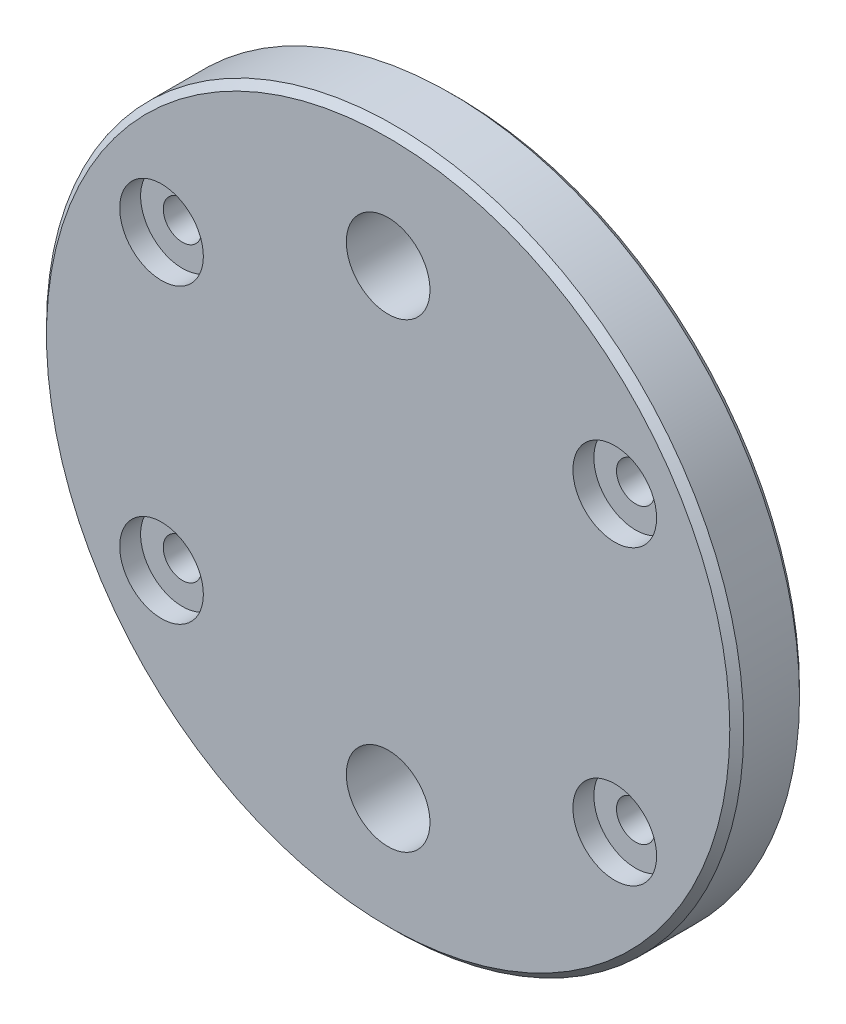
ISO-10303-21;
HEADER;
FILE_DESCRIPTION(('STEP AP214'),'2;1');
FILE_NAME('part.step','',(''),(''),'','','');
FILE_SCHEMA(('AUTOMOTIVE_DESIGN { 1 0 10303 214 1 1 1 1 }'));
ENDSEC;
DATA;
#1=APPLICATION_CONTEXT('core data for automotive mechanical design processes');
#2=APPLICATION_PROTOCOL_DEFINITION('international standard','automotive_design',2000,#1);
#3=PRODUCT_CONTEXT('',#1,'mechanical');
#4=PRODUCT('Part','Part','',(#3));
#5=PRODUCT_RELATED_PRODUCT_CATEGORY('part','',(#4));
#6=PRODUCT_DEFINITION_FORMATION('','',#4);
#7=PRODUCT_DEFINITION_CONTEXT('part definition',#1,'design');
#8=PRODUCT_DEFINITION('design','',#6,#7);
#9=PRODUCT_DEFINITION_SHAPE('','',#8);
#10=(LENGTH_UNIT() NAMED_UNIT(*) SI_UNIT(.MILLI.,.METRE.));
#11=(NAMED_UNIT(*) PLANE_ANGLE_UNIT() SI_UNIT($,.RADIAN.));
#12=(NAMED_UNIT(*) SI_UNIT($,.STERADIAN.) SOLID_ANGLE_UNIT());
#13=UNCERTAINTY_MEASURE_WITH_UNIT(LENGTH_MEASURE(1.E-05),#10,'distance_accuracy_value','');
#14=(GEOMETRIC_REPRESENTATION_CONTEXT(3) GLOBAL_UNCERTAINTY_ASSIGNED_CONTEXT((#13)) GLOBAL_UNIT_ASSIGNED_CONTEXT((#10,
#11,#12)) REPRESENTATION_CONTEXT('',''));
#15=CARTESIAN_POINT('',(0.,0.,0.));
#16=DIRECTION('',(0.,0.,1.));
#17=DIRECTION('',(1.,0.,0.));
#18=AXIS2_PLACEMENT_3D('',#15,#16,#17);
#19=CARTESIAN_POINT('',(0.,0.,0.));
#20=DIRECTION('',(0.,0.,1.));
#21=DIRECTION('',(1.,0.,0.));
#22=AXIS2_PLACEMENT_3D('',#19,#20,#21);
#23=PLANE('',#22);
#24=CARTESIAN_POINT('',(0.,0.,0.));
#25=DIRECTION('',(0.,0.,1.));
#26=DIRECTION('',(1.,0.,0.));
#27=AXIS2_PLACEMENT_3D('',#24,#25,#26);
#28=CIRCLE('',#27,49.);
#29=CARTESIAN_POINT('',(49.,0.,0.));
#30=VERTEX_POINT('',#29);
#31=EDGE_CURVE('E48',#30,#30,#28,.F.);
#32=ORIENTED_EDGE('',*,*,#31,.T.);
#33=EDGE_LOOP('',(#32));
#34=FACE_BOUND('',#33,.T.);
#35=CARTESIAN_POINT('',(32.5,21.,0.));
#36=DIRECTION('',(0.,0.,-1.));
#37=DIRECTION('',(-1.,0.,0.));
#38=AXIS2_PLACEMENT_3D('',#35,#36,#37);
#39=CIRCLE('',#38,5.6);
#40=CARTESIAN_POINT('',(26.9,21.,0.));
#41=VERTEX_POINT('',#40);
#42=EDGE_CURVE('E156',#41,#41,#39,.T.);
#43=ORIENTED_EDGE('',*,*,#42,.F.);
#44=EDGE_LOOP('',(#43));
#45=FACE_BOUND('',#44,.T.);
#46=CARTESIAN_POINT('',(32.5,-21.,0.));
#47=DIRECTION('',(0.,0.,-1.));
#48=DIRECTION('',(-1.,0.,0.));
#49=AXIS2_PLACEMENT_3D('',#46,#47,#48);
#50=CIRCLE('',#49,5.6);
#51=CARTESIAN_POINT('',(26.9,-21.,0.));
#52=VERTEX_POINT('',#51);
#53=EDGE_CURVE('E148',#52,#52,#50,.T.);
#54=ORIENTED_EDGE('',*,*,#53,.F.);
#55=EDGE_LOOP('',(#54));
#56=FACE_BOUND('',#55,.T.);
#57=CARTESIAN_POINT('',(-32.5,-21.,0.));
#58=DIRECTION('',(0.,0.,-1.));
#59=DIRECTION('',(-1.,0.,0.));
#60=AXIS2_PLACEMENT_3D('',#57,#58,#59);
#61=CIRCLE('',#60,5.6);
#62=CARTESIAN_POINT('',(-38.1,-21.,0.));
#63=VERTEX_POINT('',#62);
#64=EDGE_CURVE('E140',#63,#63,#61,.T.);
#65=ORIENTED_EDGE('',*,*,#64,.F.);
#66=EDGE_LOOP('',(#65));
#67=FACE_BOUND('',#66,.T.);
#68=CARTESIAN_POINT('',(0.,-33.07,0.));
#69=DIRECTION('',(0.,0.,1.));
#70=DIRECTION('',(1.,0.,0.));
#71=AXIS2_PLACEMENT_3D('',#68,#69,#70);
#72=CIRCLE('',#71,6.);
#73=CARTESIAN_POINT('',(6.,-33.07,0.));
#74=VERTEX_POINT('',#73);
#75=EDGE_CURVE('E112',#74,#74,#72,.T.);
#76=ORIENTED_EDGE('',*,*,#75,.T.);
#77=EDGE_LOOP('',(#76));
#78=FACE_BOUND('',#77,.T.);
#79=CARTESIAN_POINT('',(0.,33.07,0.));
#80=DIRECTION('',(0.,0.,1.));
#81=DIRECTION('',(1.,0.,0.));
#82=AXIS2_PLACEMENT_3D('',#79,#80,#81);
#83=CIRCLE('',#82,6.);
#84=CARTESIAN_POINT('',(6.,33.07,0.));
#85=VERTEX_POINT('',#84);
#86=EDGE_CURVE('E120',#85,#85,#83,.T.);
#87=ORIENTED_EDGE('',*,*,#86,.T.);
#88=EDGE_LOOP('',(#87));
#89=FACE_BOUND('',#88,.T.);
#90=CARTESIAN_POINT('',(-32.5,21.,0.));
#91=DIRECTION('',(0.,0.,-1.));
#92=DIRECTION('',(-1.,0.,0.));
#93=AXIS2_PLACEMENT_3D('',#90,#91,#92);
#94=CIRCLE('',#93,5.6);
#95=CARTESIAN_POINT('',(-38.1,21.,0.));
#96=VERTEX_POINT('',#95);
#97=EDGE_CURVE('E132',#96,#96,#94,.T.);
#98=ORIENTED_EDGE('',*,*,#97,.F.);
#99=EDGE_LOOP('',(#98));
#100=FACE_BOUND('',#99,.T.);
#101=ADVANCED_FACE('F39',(#34,#45,#56,#67,#78,#89,#100),#23,.F.);
#102=CARTESIAN_POINT('',(0.,0.,10.));
#103=DIRECTION('',(0.,0.,-1.));
#104=DIRECTION('',(-1.,0.,0.));
#105=AXIS2_PLACEMENT_3D('',#102,#103,#104);
#106=CYLINDRICAL_SURFACE('',#105,50.);
#107=CARTESIAN_POINT('',(0.,0.,1.));
#108=DIRECTION('',(0.,0.,1.));
#109=DIRECTION('',(1.,0.,0.));
#110=AXIS2_PLACEMENT_3D('',#107,#108,#109);
#111=CIRCLE('',#110,50.);
#112=CARTESIAN_POINT('',(50.,0.,1.));
#113=VERTEX_POINT('',#112);
#114=EDGE_CURVE('E53',#113,#113,#111,.T.);
#115=ORIENTED_EDGE('',*,*,#114,.T.);
#116=EDGE_LOOP('',(#115));
#117=FACE_BOUND('',#116,.T.);
#118=CARTESIAN_POINT('',(0.,0.,9.00000000000004));
#119=DIRECTION('',(0.,0.,1.));
#120=DIRECTION('',(1.,0.,0.));
#121=AXIS2_PLACEMENT_3D('',#118,#119,#120);
#122=CIRCLE('',#121,50.);
#123=CARTESIAN_POINT('',(50.,0.,9.00000000000004));
#124=VERTEX_POINT('',#123);
#125=EDGE_CURVE('E58',#124,#124,#122,.F.);
#126=ORIENTED_EDGE('',*,*,#125,.T.);
#127=EDGE_LOOP('',(#126));
#128=FACE_BOUND('',#127,.T.);
#129=ADVANCED_FACE('F165',(#117,#128),#106,.T.);
#130=CARTESIAN_POINT('',(0.,0.,10.));
#131=DIRECTION('',(0.,0.,1.));
#132=DIRECTION('',(1.,0.,0.));
#133=AXIS2_PLACEMENT_3D('',#130,#131,#132);
#134=PLANE('',#133);
#135=CARTESIAN_POINT('',(0.,0.,10.));
#136=DIRECTION('',(0.,0.,1.));
#137=DIRECTION('',(1.,0.,0.));
#138=AXIS2_PLACEMENT_3D('',#135,#136,#137);
#139=CIRCLE('',#138,49.0000000000001);
#140=CARTESIAN_POINT('',(49.0000000000001,0.,10.));
#141=VERTEX_POINT('',#140);
#142=EDGE_CURVE('E10',#141,#141,#139,.T.);
#143=ORIENTED_EDGE('',*,*,#142,.T.);
#144=EDGE_LOOP('',(#143));
#145=FACE_BOUND('',#144,.T.);
#146=CARTESIAN_POINT('',(0.,33.07,10.));
#147=DIRECTION('',(0.,0.,1.));
#148=DIRECTION('',(1.,0.,0.));
#149=AXIS2_PLACEMENT_3D('',#146,#147,#148);
#150=CIRCLE('',#149,6.);
#151=CARTESIAN_POINT('',(6.,33.07,10.));
#152=VERTEX_POINT('',#151);
#153=EDGE_CURVE('E124',#152,#152,#150,.T.);
#154=ORIENTED_EDGE('',*,*,#153,.F.);
#155=EDGE_LOOP('',(#154));
#156=FACE_BOUND('',#155,.T.);
#157=CARTESIAN_POINT('',(0.,-33.07,10.));
#158=DIRECTION('',(0.,0.,1.));
#159=DIRECTION('',(1.,0.,0.));
#160=AXIS2_PLACEMENT_3D('',#157,#158,#159);
#161=CIRCLE('',#160,6.);
#162=CARTESIAN_POINT('',(6.,-33.07,10.));
#163=VERTEX_POINT('',#162);
#164=EDGE_CURVE('E116',#163,#163,#161,.T.);
#165=ORIENTED_EDGE('',*,*,#164,.F.);
#166=EDGE_LOOP('',(#165));
#167=FACE_BOUND('',#166,.T.);
#168=CARTESIAN_POINT('',(-32.5,21.,10.));
#169=DIRECTION('',(0.,0.,1.));
#170=DIRECTION('',(1.,0.,0.));
#171=AXIS2_PLACEMENT_3D('',#168,#169,#170);
#172=CIRCLE('',#171,6.);
#173=CARTESIAN_POINT('',(-26.5,21.,10.));
#174=VERTEX_POINT('',#173);
#175=EDGE_CURVE('E108',#174,#174,#172,.T.);
#176=ORIENTED_EDGE('',*,*,#175,.F.);
#177=EDGE_LOOP('',(#176));
#178=FACE_BOUND('',#177,.T.);
#179=CARTESIAN_POINT('',(32.5,21.,10.));
#180=DIRECTION('',(0.,0.,1.));
#181=DIRECTION('',(1.,0.,0.));
#182=AXIS2_PLACEMENT_3D('',#179,#180,#181);
#183=CIRCLE('',#182,6.);
#184=CARTESIAN_POINT('',(38.5,21.,10.));
#185=VERTEX_POINT('',#184);
#186=EDGE_CURVE('E96',#185,#185,#183,.T.);
#187=ORIENTED_EDGE('',*,*,#186,.F.);
#188=EDGE_LOOP('',(#187));
#189=FACE_BOUND('',#188,.T.);
#190=CARTESIAN_POINT('',(32.5,-21.,10.));
#191=DIRECTION('',(0.,0.,1.));
#192=DIRECTION('',(1.,0.,0.));
#193=AXIS2_PLACEMENT_3D('',#190,#191,#192);
#194=CIRCLE('',#193,6.);
#195=CARTESIAN_POINT('',(38.5,-21.,10.));
#196=VERTEX_POINT('',#195);
#197=EDGE_CURVE('E84',#196,#196,#194,.T.);
#198=ORIENTED_EDGE('',*,*,#197,.F.);
#199=EDGE_LOOP('',(#198));
#200=FACE_BOUND('',#199,.T.);
#201=CARTESIAN_POINT('',(-32.5,-21.,10.));
#202=DIRECTION('',(0.,0.,1.));
#203=DIRECTION('',(1.,0.,0.));
#204=AXIS2_PLACEMENT_3D('',#201,#202,#203);
#205=CIRCLE('',#204,6.);
#206=CARTESIAN_POINT('',(-26.5,-21.,10.));
#207=VERTEX_POINT('',#206);
#208=EDGE_CURVE('E72',#207,#207,#205,.T.);
#209=ORIENTED_EDGE('',*,*,#208,.F.);
#210=EDGE_LOOP('',(#209));
#211=FACE_BOUND('',#210,.T.);
#212=ADVANCED_FACE('F246',(#145,#156,#167,#178,#189,#200,#211),#134,.T.);
#213=CARTESIAN_POINT('',(-32.5,-21.,10.));
#214=DIRECTION('',(0.,0.,1.));
#215=DIRECTION('',(1.,0.,0.));
#216=AXIS2_PLACEMENT_3D('',#213,#214,#215);
#217=CYLINDRICAL_SURFACE('',#216,2.75);
#218=CARTESIAN_POINT('',(-32.5,-21.,2.85));
#219=DIRECTION('',(0.,0.,-1.));
#220=DIRECTION('',(-1.,0.,0.));
#221=AXIS2_PLACEMENT_3D('',#218,#219,#220);
#222=CIRCLE('',#221,2.75);
#223=CARTESIAN_POINT('',(-35.25,-21.,2.85));
#224=VERTEX_POINT('',#223);
#225=EDGE_CURVE('E136',#224,#224,#222,.T.);
#226=ORIENTED_EDGE('',*,*,#225,.T.);
#227=EDGE_LOOP('',(#226));
#228=FACE_BOUND('',#227,.T.);
#229=CARTESIAN_POINT('',(-32.5,-21.,7.));
#230=DIRECTION('',(0.,0.,1.));
#231=DIRECTION('',(1.,0.,0.));
#232=AXIS2_PLACEMENT_3D('',#229,#230,#231);
#233=CIRCLE('',#232,2.75);
#234=CARTESIAN_POINT('',(-29.75,-21.,7.));
#235=VERTEX_POINT('',#234);
#236=EDGE_CURVE('E64',#235,#235,#233,.T.);
#237=ORIENTED_EDGE('',*,*,#236,.T.);
#238=EDGE_LOOP('',(#237));
#239=FACE_BOUND('',#238,.T.);
#240=ADVANCED_FACE('F242',(#228,#239),#217,.F.);
#241=CARTESIAN_POINT('',(-29.75,-21.,7.));
#242=DIRECTION('',(0.,0.,-1.));
#243=DIRECTION('',(-1.,0.,0.));
#244=AXIS2_PLACEMENT_3D('',#241,#242,#243);
#245=PLANE('',#244);
#246=ORIENTED_EDGE('',*,*,#236,.F.);
#247=EDGE_LOOP('',(#246));
#248=FACE_BOUND('',#247,.T.);
#249=CARTESIAN_POINT('',(-32.5,-21.,7.));
#250=DIRECTION('',(0.,0.,1.));
#251=DIRECTION('',(1.,0.,0.));
#252=AXIS2_PLACEMENT_3D('',#249,#250,#251);
#253=CIRCLE('',#252,6.);
#254=CARTESIAN_POINT('',(-26.5,-21.,7.));
#255=VERTEX_POINT('',#254);
#256=EDGE_CURVE('E68',#255,#255,#253,.T.);
#257=ORIENTED_EDGE('',*,*,#256,.T.);
#258=EDGE_LOOP('',(#257));
#259=FACE_BOUND('',#258,.T.);
#260=ADVANCED_FACE('F238',(#248,#259),#245,.F.);
#261=CARTESIAN_POINT('',(-32.5,-21.,10.));
#262=DIRECTION('',(0.,0.,1.));
#263=DIRECTION('',(1.,0.,0.));
#264=AXIS2_PLACEMENT_3D('',#261,#262,#263);
#265=CYLINDRICAL_SURFACE('',#264,6.);
#266=ORIENTED_EDGE('',*,*,#256,.F.);
#267=EDGE_LOOP('',(#266));
#268=FACE_BOUND('',#267,.T.);
#269=ORIENTED_EDGE('',*,*,#208,.T.);
#270=EDGE_LOOP('',(#269));
#271=FACE_BOUND('',#270,.T.);
#272=ADVANCED_FACE('F234',(#268,#271),#265,.F.);
#273=CARTESIAN_POINT('',(32.5,-21.,10.));
#274=DIRECTION('',(0.,0.,1.));
#275=DIRECTION('',(1.,0.,0.));
#276=AXIS2_PLACEMENT_3D('',#273,#274,#275);
#277=CYLINDRICAL_SURFACE('',#276,2.75);
#278=CARTESIAN_POINT('',(32.5,-21.,2.85));
#279=DIRECTION('',(0.,0.,-1.));
#280=DIRECTION('',(-1.,0.,0.));
#281=AXIS2_PLACEMENT_3D('',#278,#279,#280);
#282=CIRCLE('',#281,2.75);
#283=CARTESIAN_POINT('',(29.75,-21.,2.85));
#284=VERTEX_POINT('',#283);
#285=EDGE_CURVE('E144',#284,#284,#282,.T.);
#286=ORIENTED_EDGE('',*,*,#285,.T.);
#287=EDGE_LOOP('',(#286));
#288=FACE_BOUND('',#287,.T.);
#289=CARTESIAN_POINT('',(32.5,-21.,7.));
#290=DIRECTION('',(0.,0.,1.));
#291=DIRECTION('',(1.,0.,0.));
#292=AXIS2_PLACEMENT_3D('',#289,#290,#291);
#293=CIRCLE('',#292,2.75);
#294=CARTESIAN_POINT('',(35.25,-21.,7.));
#295=VERTEX_POINT('',#294);
#296=EDGE_CURVE('E76',#295,#295,#293,.T.);
#297=ORIENTED_EDGE('',*,*,#296,.T.);
#298=EDGE_LOOP('',(#297));
#299=FACE_BOUND('',#298,.T.);
#300=ADVANCED_FACE('F230',(#288,#299),#277,.F.);
#301=CARTESIAN_POINT('',(35.25,-21.,7.));
#302=DIRECTION('',(0.,0.,-1.));
#303=DIRECTION('',(-1.,0.,0.));
#304=AXIS2_PLACEMENT_3D('',#301,#302,#303);
#305=PLANE('',#304);
#306=ORIENTED_EDGE('',*,*,#296,.F.);
#307=EDGE_LOOP('',(#306));
#308=FACE_BOUND('',#307,.T.);
#309=CARTESIAN_POINT('',(32.5,-21.,7.));
#310=DIRECTION('',(0.,0.,1.));
#311=DIRECTION('',(1.,0.,0.));
#312=AXIS2_PLACEMENT_3D('',#309,#310,#311);
#313=CIRCLE('',#312,6.);
#314=CARTESIAN_POINT('',(38.5,-21.,7.));
#315=VERTEX_POINT('',#314);
#316=EDGE_CURVE('E80',#315,#315,#313,.T.);
#317=ORIENTED_EDGE('',*,*,#316,.T.);
#318=EDGE_LOOP('',(#317));
#319=FACE_BOUND('',#318,.T.);
#320=ADVANCED_FACE('F226',(#308,#319),#305,.F.);
#321=CARTESIAN_POINT('',(32.5,-21.,10.));
#322=DIRECTION('',(0.,0.,1.));
#323=DIRECTION('',(1.,0.,0.));
#324=AXIS2_PLACEMENT_3D('',#321,#322,#323);
#325=CYLINDRICAL_SURFACE('',#324,6.);
#326=ORIENTED_EDGE('',*,*,#316,.F.);
#327=EDGE_LOOP('',(#326));
#328=FACE_BOUND('',#327,.T.);
#329=ORIENTED_EDGE('',*,*,#197,.T.);
#330=EDGE_LOOP('',(#329));
#331=FACE_BOUND('',#330,.T.);
#332=ADVANCED_FACE('F222',(#328,#331),#325,.F.);
#333=CARTESIAN_POINT('',(32.5,21.,10.));
#334=DIRECTION('',(0.,0.,1.));
#335=DIRECTION('',(1.,0.,0.));
#336=AXIS2_PLACEMENT_3D('',#333,#334,#335);
#337=CYLINDRICAL_SURFACE('',#336,2.75);
#338=CARTESIAN_POINT('',(32.5,21.,2.85));
#339=DIRECTION('',(0.,0.,-1.));
#340=DIRECTION('',(-1.,0.,0.));
#341=AXIS2_PLACEMENT_3D('',#338,#339,#340);
#342=CIRCLE('',#341,2.75);
#343=CARTESIAN_POINT('',(29.75,21.,2.85));
#344=VERTEX_POINT('',#343);
#345=EDGE_CURVE('E152',#344,#344,#342,.T.);
#346=ORIENTED_EDGE('',*,*,#345,.T.);
#347=EDGE_LOOP('',(#346));
#348=FACE_BOUND('',#347,.T.);
#349=CARTESIAN_POINT('',(32.5,21.,7.));
#350=DIRECTION('',(0.,0.,1.));
#351=DIRECTION('',(1.,0.,0.));
#352=AXIS2_PLACEMENT_3D('',#349,#350,#351);
#353=CIRCLE('',#352,2.75);
#354=CARTESIAN_POINT('',(35.25,21.,7.));
#355=VERTEX_POINT('',#354);
#356=EDGE_CURVE('E88',#355,#355,#353,.T.);
#357=ORIENTED_EDGE('',*,*,#356,.T.);
#358=EDGE_LOOP('',(#357));
#359=FACE_BOUND('',#358,.T.);
#360=ADVANCED_FACE('F218',(#348,#359),#337,.F.);
#361=CARTESIAN_POINT('',(35.25,21.,7.));
#362=DIRECTION('',(0.,0.,-1.));
#363=DIRECTION('',(-1.,0.,0.));
#364=AXIS2_PLACEMENT_3D('',#361,#362,#363);
#365=PLANE('',#364);
#366=ORIENTED_EDGE('',*,*,#356,.F.);
#367=EDGE_LOOP('',(#366));
#368=FACE_BOUND('',#367,.T.);
#369=CARTESIAN_POINT('',(32.5,21.,7.));
#370=DIRECTION('',(0.,0.,1.));
#371=DIRECTION('',(1.,0.,0.));
#372=AXIS2_PLACEMENT_3D('',#369,#370,#371);
#373=CIRCLE('',#372,6.);
#374=CARTESIAN_POINT('',(38.5,21.,7.));
#375=VERTEX_POINT('',#374);
#376=EDGE_CURVE('E92',#375,#375,#373,.T.);
#377=ORIENTED_EDGE('',*,*,#376,.T.);
#378=EDGE_LOOP('',(#377));
#379=FACE_BOUND('',#378,.T.);
#380=ADVANCED_FACE('F214',(#368,#379),#365,.F.);
#381=CARTESIAN_POINT('',(32.5,21.,10.));
#382=DIRECTION('',(0.,0.,1.));
#383=DIRECTION('',(1.,0.,0.));
#384=AXIS2_PLACEMENT_3D('',#381,#382,#383);
#385=CYLINDRICAL_SURFACE('',#384,6.);
#386=ORIENTED_EDGE('',*,*,#376,.F.);
#387=EDGE_LOOP('',(#386));
#388=FACE_BOUND('',#387,.T.);
#389=ORIENTED_EDGE('',*,*,#186,.T.);
#390=EDGE_LOOP('',(#389));
#391=FACE_BOUND('',#390,.T.);
#392=ADVANCED_FACE('F210',(#388,#391),#385,.F.);
#393=CARTESIAN_POINT('',(-32.5,21.,10.));
#394=DIRECTION('',(0.,0.,1.));
#395=DIRECTION('',(1.,0.,0.));
#396=AXIS2_PLACEMENT_3D('',#393,#394,#395);
#397=CYLINDRICAL_SURFACE('',#396,2.75);
#398=CARTESIAN_POINT('',(-32.5,21.,2.85));
#399=DIRECTION('',(0.,0.,-1.));
#400=DIRECTION('',(-1.,0.,0.));
#401=AXIS2_PLACEMENT_3D('',#398,#399,#400);
#402=CIRCLE('',#401,2.75);
#403=CARTESIAN_POINT('',(-35.25,21.,2.85));
#404=VERTEX_POINT('',#403);
#405=EDGE_CURVE('E128',#404,#404,#402,.T.);
#406=ORIENTED_EDGE('',*,*,#405,.T.);
#407=EDGE_LOOP('',(#406));
#408=FACE_BOUND('',#407,.T.);
#409=CARTESIAN_POINT('',(-32.5,21.,7.));
#410=DIRECTION('',(0.,0.,1.));
#411=DIRECTION('',(1.,0.,0.));
#412=AXIS2_PLACEMENT_3D('',#409,#410,#411);
#413=CIRCLE('',#412,2.75);
#414=CARTESIAN_POINT('',(-29.75,21.,7.));
#415=VERTEX_POINT('',#414);
#416=EDGE_CURVE('E100',#415,#415,#413,.T.);
#417=ORIENTED_EDGE('',*,*,#416,.T.);
#418=EDGE_LOOP('',(#417));
#419=FACE_BOUND('',#418,.T.);
#420=ADVANCED_FACE('F206',(#408,#419),#397,.F.);
#421=CARTESIAN_POINT('',(-29.75,21.,7.));
#422=DIRECTION('',(0.,0.,-1.));
#423=DIRECTION('',(-1.,0.,0.));
#424=AXIS2_PLACEMENT_3D('',#421,#422,#423);
#425=PLANE('',#424);
#426=ORIENTED_EDGE('',*,*,#416,.F.);
#427=EDGE_LOOP('',(#426));
#428=FACE_BOUND('',#427,.T.);
#429=CARTESIAN_POINT('',(-32.5,21.,7.));
#430=DIRECTION('',(0.,0.,1.));
#431=DIRECTION('',(1.,0.,0.));
#432=AXIS2_PLACEMENT_3D('',#429,#430,#431);
#433=CIRCLE('',#432,6.);
#434=CARTESIAN_POINT('',(-26.5,21.,7.));
#435=VERTEX_POINT('',#434);
#436=EDGE_CURVE('E104',#435,#435,#433,.T.);
#437=ORIENTED_EDGE('',*,*,#436,.T.);
#438=EDGE_LOOP('',(#437));
#439=FACE_BOUND('',#438,.T.);
#440=ADVANCED_FACE('F202',(#428,#439),#425,.F.);
#441=CARTESIAN_POINT('',(-32.5,21.,10.));
#442=DIRECTION('',(0.,0.,1.));
#443=DIRECTION('',(1.,0.,0.));
#444=AXIS2_PLACEMENT_3D('',#441,#442,#443);
#445=CYLINDRICAL_SURFACE('',#444,6.);
#446=ORIENTED_EDGE('',*,*,#436,.F.);
#447=EDGE_LOOP('',(#446));
#448=FACE_BOUND('',#447,.T.);
#449=ORIENTED_EDGE('',*,*,#175,.T.);
#450=EDGE_LOOP('',(#449));
#451=FACE_BOUND('',#450,.T.);
#452=ADVANCED_FACE('F198',(#448,#451),#445,.F.);
#453=CARTESIAN_POINT('',(0.,-33.07,10.));
#454=DIRECTION('',(0.,0.,1.));
#455=DIRECTION('',(1.,0.,0.));
#456=AXIS2_PLACEMENT_3D('',#453,#454,#455);
#457=CYLINDRICAL_SURFACE('',#456,6.);
#458=ORIENTED_EDGE('',*,*,#75,.F.);
#459=EDGE_LOOP('',(#458));
#460=FACE_BOUND('',#459,.T.);
#461=ORIENTED_EDGE('',*,*,#164,.T.);
#462=EDGE_LOOP('',(#461));
#463=FACE_BOUND('',#462,.T.);
#464=ADVANCED_FACE('F190',(#460,#463),#457,.F.);
#465=CARTESIAN_POINT('',(0.,33.07,10.));
#466=DIRECTION('',(0.,0.,1.));
#467=DIRECTION('',(1.,0.,0.));
#468=AXIS2_PLACEMENT_3D('',#465,#466,#467);
#469=CYLINDRICAL_SURFACE('',#468,6.);
#470=ORIENTED_EDGE('',*,*,#86,.F.);
#471=EDGE_LOOP('',(#470));
#472=FACE_BOUND('',#471,.T.);
#473=ORIENTED_EDGE('',*,*,#153,.T.);
#474=EDGE_LOOP('',(#473));
#475=FACE_BOUND('',#474,.T.);
#476=ADVANCED_FACE('F180',(#472,#475),#469,.F.);
#477=CARTESIAN_POINT('',(-32.5,21.,0.));
#478=DIRECTION('',(0.,0.,-1.));
#479=DIRECTION('',(-1.,0.,0.));
#480=AXIS2_PLACEMENT_3D('',#477,#478,#479);
#481=CONICAL_SURFACE('',#480,5.6,0.785398163397449);
#482=ORIENTED_EDGE('',*,*,#405,.F.);
#483=EDGE_LOOP('',(#482));
#484=FACE_BOUND('',#483,.T.);
#485=ORIENTED_EDGE('',*,*,#97,.T.);
#486=EDGE_LOOP('',(#485));
#487=FACE_BOUND('',#486,.T.);
#488=ADVANCED_FACE('F177',(#484,#487),#481,.F.);
#489=CARTESIAN_POINT('',(-32.5,-21.,0.));
#490=DIRECTION('',(0.,0.,-1.));
#491=DIRECTION('',(-1.,0.,0.));
#492=AXIS2_PLACEMENT_3D('',#489,#490,#491);
#493=CONICAL_SURFACE('',#492,5.6,0.785398163397449);
#494=ORIENTED_EDGE('',*,*,#225,.F.);
#495=EDGE_LOOP('',(#494));
#496=FACE_BOUND('',#495,.T.);
#497=ORIENTED_EDGE('',*,*,#64,.T.);
#498=EDGE_LOOP('',(#497));
#499=FACE_BOUND('',#498,.T.);
#500=ADVANCED_FACE('F179',(#496,#499),#493,.F.);
#501=CARTESIAN_POINT('',(32.5,-21.,0.));
#502=DIRECTION('',(0.,0.,-1.));
#503=DIRECTION('',(-1.,0.,0.));
#504=AXIS2_PLACEMENT_3D('',#501,#502,#503);
#505=CONICAL_SURFACE('',#504,5.6,0.785398163397449);
#506=ORIENTED_EDGE('',*,*,#285,.F.);
#507=EDGE_LOOP('',(#506));
#508=FACE_BOUND('',#507,.T.);
#509=ORIENTED_EDGE('',*,*,#53,.T.);
#510=EDGE_LOOP('',(#509));
#511=FACE_BOUND('',#510,.T.);
#512=ADVANCED_FACE('F187',(#508,#511),#505,.F.);
#513=CARTESIAN_POINT('',(32.5,21.,0.));
#514=DIRECTION('',(0.,0.,-1.));
#515=DIRECTION('',(-1.,0.,0.));
#516=AXIS2_PLACEMENT_3D('',#513,#514,#515);
#517=CONICAL_SURFACE('',#516,5.6,0.785398163397449);
#518=ORIENTED_EDGE('',*,*,#345,.F.);
#519=EDGE_LOOP('',(#518));
#520=FACE_BOUND('',#519,.T.);
#521=ORIENTED_EDGE('',*,*,#42,.T.);
#522=EDGE_LOOP('',(#521));
#523=FACE_BOUND('',#522,.T.);
#524=ADVANCED_FACE('F161',(#520,#523),#517,.F.);
#525=CARTESIAN_POINT('',(0.,0.,1.));
#526=DIRECTION('',(0.,0.,1.));
#527=DIRECTION('',(1.,0.,0.));
#528=AXIS2_PLACEMENT_3D('',#525,#526,#527);
#529=CONICAL_SURFACE('',#528,50.,0.785398163397452);
#530=ORIENTED_EDGE('',*,*,#31,.F.);
#531=EDGE_LOOP('',(#530));
#532=FACE_BOUND('',#531,.T.);
#533=ORIENTED_EDGE('',*,*,#114,.F.);
#534=EDGE_LOOP('',(#533));
#535=FACE_BOUND('',#534,.T.);
#536=ADVANCED_FACE('F253',(#532,#535),#529,.T.);
#537=CARTESIAN_POINT('',(0.,0.,10.));
#538=DIRECTION('',(0.,0.,-1.));
#539=DIRECTION('',(-1.,0.,0.));
#540=AXIS2_PLACEMENT_3D('',#537,#538,#539);
#541=CONICAL_SURFACE('',#540,49.0000000000001,0.785398163397438);
#542=ORIENTED_EDGE('',*,*,#125,.F.);
#543=EDGE_LOOP('',(#542));
#544=FACE_BOUND('',#543,.T.);
#545=ORIENTED_EDGE('',*,*,#142,.F.);
#546=EDGE_LOOP('',(#545));
#547=FACE_BOUND('',#546,.T.);
#548=ADVANCED_FACE('F42',(#544,#547),#541,.T.);
#549=CLOSED_SHELL('',(#101,#129,#212,#240,#260,#272,#300,#320,#332,#360,#380,#392,#420,#440,
#452,#464,#476,#488,#500,#512,#524,#536,#548));
#550=MANIFOLD_SOLID_BREP('B2',#549);
#551=ADVANCED_BREP_SHAPE_REPRESENTATION('',(#18,#550),#14);
#552=SHAPE_DEFINITION_REPRESENTATION(#9,#551);
ENDSEC;
END-ISO-10303-21;
